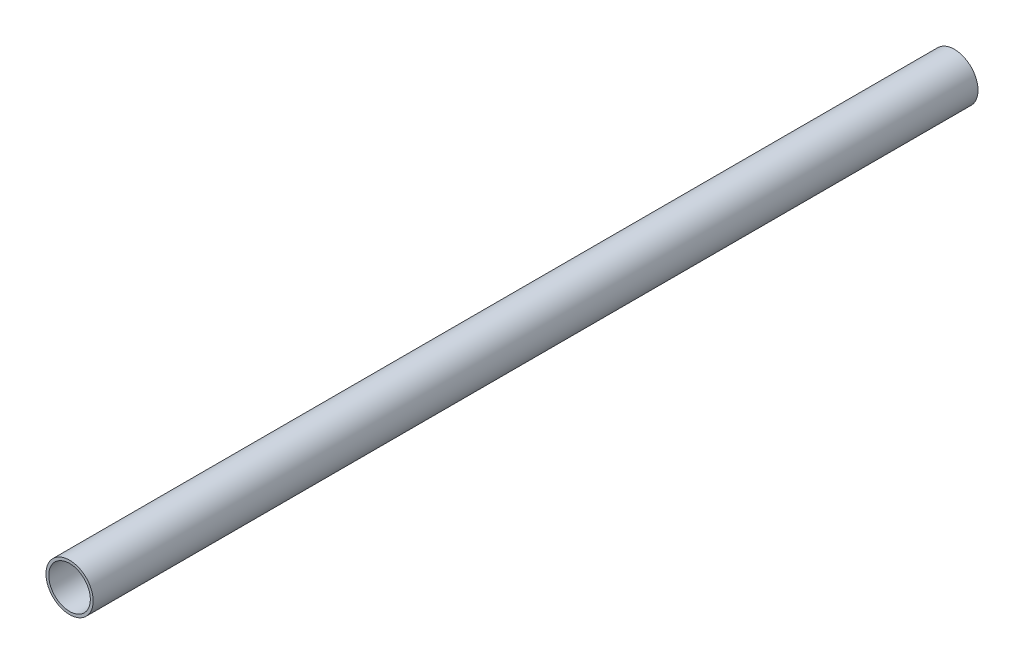
ISO-10303-21;
HEADER;
FILE_DESCRIPTION(('STEP AP214'),'2;1');
FILE_NAME('part.step','',(''),(''),'','','');
FILE_SCHEMA(('AUTOMOTIVE_DESIGN { 1 0 10303 214 1 1 1 1 }'));
ENDSEC;
DATA;
#1=APPLICATION_CONTEXT('core data for automotive mechanical design processes');
#2=APPLICATION_PROTOCOL_DEFINITION('international standard','automotive_design',2000,#1);
#3=PRODUCT_CONTEXT('',#1,'mechanical');
#4=PRODUCT('Part','Part','',(#3));
#5=PRODUCT_RELATED_PRODUCT_CATEGORY('part','',(#4));
#6=PRODUCT_DEFINITION_FORMATION('','',#4);
#7=PRODUCT_DEFINITION_CONTEXT('part definition',#1,'design');
#8=PRODUCT_DEFINITION('design','',#6,#7);
#9=PRODUCT_DEFINITION_SHAPE('','',#8);
#10=(LENGTH_UNIT() NAMED_UNIT(*) SI_UNIT(.MILLI.,.METRE.));
#11=(NAMED_UNIT(*) PLANE_ANGLE_UNIT() SI_UNIT($,.RADIAN.));
#12=(NAMED_UNIT(*) SI_UNIT($,.STERADIAN.) SOLID_ANGLE_UNIT());
#13=UNCERTAINTY_MEASURE_WITH_UNIT(LENGTH_MEASURE(1.E-05),#10,'distance_accuracy_value','');
#14=(GEOMETRIC_REPRESENTATION_CONTEXT(3) GLOBAL_UNCERTAINTY_ASSIGNED_CONTEXT((#13)) GLOBAL_UNIT_ASSIGNED_CONTEXT((#10,
#11,#12)) REPRESENTATION_CONTEXT('',''));
#15=CARTESIAN_POINT('',(0.,0.,0.));
#16=DIRECTION('',(0.,0.,1.));
#17=DIRECTION('',(1.,0.,0.));
#18=AXIS2_PLACEMENT_3D('',#15,#16,#17);
#19=CARTESIAN_POINT('',(0.,0.,600.));
#20=DIRECTION('',(0.,0.,1.));
#21=DIRECTION('',(1.,0.,0.));
#22=AXIS2_PLACEMENT_3D('',#19,#20,#21);
#23=PLANE('',#22);
#24=CARTESIAN_POINT('',(0.,0.,600.));
#25=DIRECTION('',(0.,0.,1.));
#26=DIRECTION('',(1.,0.,0.));
#27=AXIS2_PLACEMENT_3D('',#24,#25,#26);
#28=CIRCLE('',#27,16.);
#29=CARTESIAN_POINT('',(16.,0.,600.));
#30=VERTEX_POINT('',#29);
#31=EDGE_CURVE('E10',#30,#30,#28,.T.);
#32=ORIENTED_EDGE('',*,*,#31,.T.);
#33=EDGE_LOOP('',(#32));
#34=FACE_BOUND('',#33,.T.);
#35=CARTESIAN_POINT('',(0.,0.,600.));
#36=DIRECTION('',(0.,0.,1.));
#37=DIRECTION('',(1.,0.,0.));
#38=AXIS2_PLACEMENT_3D('',#35,#36,#37);
#39=CIRCLE('',#38,14.1);
#40=CARTESIAN_POINT('',(14.1,0.,600.));
#41=VERTEX_POINT('',#40);
#42=EDGE_CURVE('E41',#41,#41,#39,.T.);
#43=ORIENTED_EDGE('',*,*,#42,.F.);
#44=EDGE_LOOP('',(#43));
#45=FACE_BOUND('',#44,.T.);
#46=ADVANCED_FACE('F30',(#34,#45),#23,.T.);
#47=CARTESIAN_POINT('',(0.,0.,0.));
#48=DIRECTION('',(0.,0.,1.));
#49=DIRECTION('',(1.,0.,0.));
#50=AXIS2_PLACEMENT_3D('',#47,#48,#49);
#51=PLANE('',#50);
#52=CARTESIAN_POINT('',(0.,0.,0.));
#53=DIRECTION('',(0.,0.,1.));
#54=DIRECTION('',(1.,0.,0.));
#55=AXIS2_PLACEMENT_3D('',#52,#53,#54);
#56=CIRCLE('',#55,16.);
#57=CARTESIAN_POINT('',(16.,0.,0.));
#58=VERTEX_POINT('',#57);
#59=EDGE_CURVE('E34',#58,#58,#56,.T.);
#60=ORIENTED_EDGE('',*,*,#59,.F.);
#61=EDGE_LOOP('',(#60));
#62=FACE_BOUND('',#61,.T.);
#63=CARTESIAN_POINT('',(0.,0.,0.));
#64=DIRECTION('',(0.,0.,1.));
#65=DIRECTION('',(1.,0.,0.));
#66=AXIS2_PLACEMENT_3D('',#63,#64,#65);
#67=CIRCLE('',#66,14.1);
#68=CARTESIAN_POINT('',(14.1,0.,0.));
#69=VERTEX_POINT('',#68);
#70=EDGE_CURVE('E43',#69,#69,#67,.T.);
#71=ORIENTED_EDGE('',*,*,#70,.T.);
#72=EDGE_LOOP('',(#71));
#73=FACE_BOUND('',#72,.T.);
#74=ADVANCED_FACE('F53',(#62,#73),#51,.F.);
#75=CARTESIAN_POINT('',(0.,0.,600.));
#76=DIRECTION('',(0.,0.,-1.));
#77=DIRECTION('',(-1.,0.,0.));
#78=AXIS2_PLACEMENT_3D('',#75,#76,#77);
#79=CYLINDRICAL_SURFACE('',#78,16.);
#80=ORIENTED_EDGE('',*,*,#31,.F.);
#81=EDGE_LOOP('',(#80));
#82=FACE_BOUND('',#81,.T.);
#83=ORIENTED_EDGE('',*,*,#59,.T.);
#84=EDGE_LOOP('',(#83));
#85=FACE_BOUND('',#84,.T.);
#86=ADVANCED_FACE('F32',(#82,#85),#79,.T.);
#87=CARTESIAN_POINT('',(0.,0.,600.));
#88=DIRECTION('',(0.,0.,-1.));
#89=DIRECTION('',(-1.,0.,0.));
#90=AXIS2_PLACEMENT_3D('',#87,#88,#89);
#91=CYLINDRICAL_SURFACE('',#90,14.1);
#92=ORIENTED_EDGE('',*,*,#42,.T.);
#93=EDGE_LOOP('',(#92));
#94=FACE_BOUND('',#93,.T.);
#95=ORIENTED_EDGE('',*,*,#70,.F.);
#96=EDGE_LOOP('',(#95));
#97=FACE_BOUND('',#96,.T.);
#98=ADVANCED_FACE('F49',(#94,#97),#91,.F.);
#99=CLOSED_SHELL('',(#46,#74,#86,#98));
#100=MANIFOLD_SOLID_BREP('B2',#99);
#101=ADVANCED_BREP_SHAPE_REPRESENTATION('',(#18,#100),#14);
#102=SHAPE_DEFINITION_REPRESENTATION(#9,#101);
ENDSEC;
END-ISO-10303-21;
